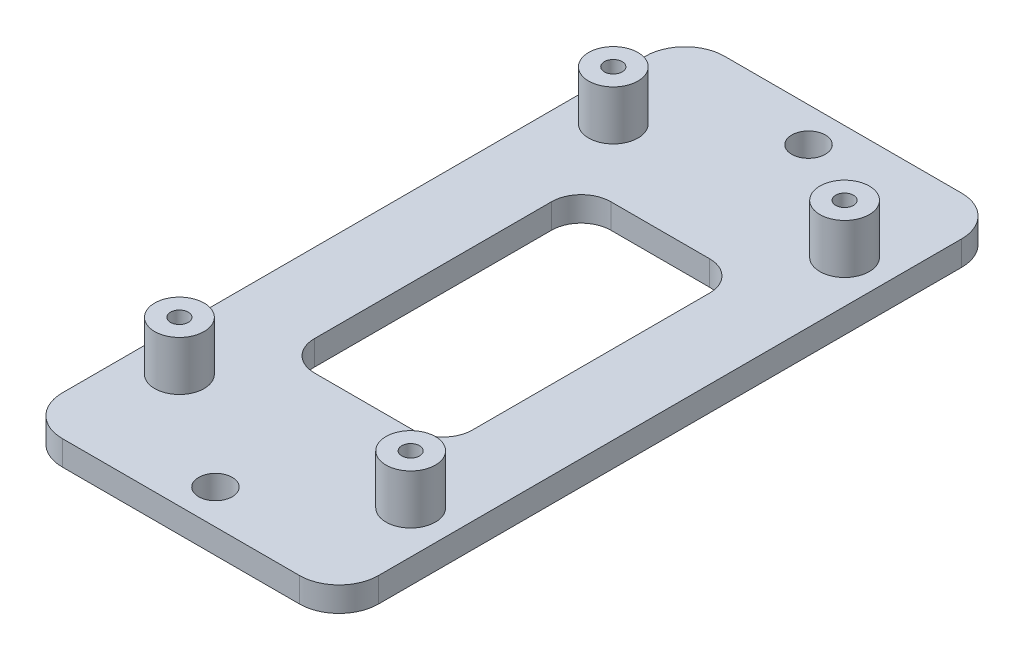
ISO-10303-21;
HEADER;
FILE_DESCRIPTION(('STEP AP214'),'2;1');
FILE_NAME('part.step','',(''),(''),'','','');
FILE_SCHEMA(('AUTOMOTIVE_DESIGN { 1 0 10303 214 1 1 1 1 }'));
ENDSEC;
DATA;
#1=APPLICATION_CONTEXT('core data for automotive mechanical design processes');
#2=APPLICATION_PROTOCOL_DEFINITION('international standard','automotive_design',2000,#1);
#3=PRODUCT_CONTEXT('',#1,'mechanical');
#4=PRODUCT('Part','Part','',(#3));
#5=PRODUCT_RELATED_PRODUCT_CATEGORY('part','',(#4));
#6=PRODUCT_DEFINITION_FORMATION('','',#4);
#7=PRODUCT_DEFINITION_CONTEXT('part definition',#1,'design');
#8=PRODUCT_DEFINITION('design','',#6,#7);
#9=PRODUCT_DEFINITION_SHAPE('','',#8);
#10=(LENGTH_UNIT() NAMED_UNIT(*) SI_UNIT(.MILLI.,.METRE.));
#11=(NAMED_UNIT(*) PLANE_ANGLE_UNIT() SI_UNIT($,.RADIAN.));
#12=(NAMED_UNIT(*) SI_UNIT($,.STERADIAN.) SOLID_ANGLE_UNIT());
#13=UNCERTAINTY_MEASURE_WITH_UNIT(LENGTH_MEASURE(1.E-05),#10,'distance_accuracy_value','');
#14=(GEOMETRIC_REPRESENTATION_CONTEXT(3) GLOBAL_UNCERTAINTY_ASSIGNED_CONTEXT((#13)) GLOBAL_UNIT_ASSIGNED_CONTEXT((#10,
#11,#12)) REPRESENTATION_CONTEXT('',''));
#15=CARTESIAN_POINT('',(0.,0.,0.));
#16=DIRECTION('',(0.,0.,1.));
#17=DIRECTION('',(1.,0.,0.));
#18=AXIS2_PLACEMENT_3D('',#15,#16,#17);
#19=CARTESIAN_POINT('',(274.95,496.02,534.67));
#20=DIRECTION('',(0.,-1.,0.));
#21=DIRECTION('',(0.,0.,-1.));
#22=AXIS2_PLACEMENT_3D('',#19,#20,#21);
#23=PLANE('',#22);
#24=CARTESIAN_POINT('',(274.95,496.02,534.67));
#25=DIRECTION('',(0.,-1.,0.));
#26=DIRECTION('',(1.,0.,0.));
#27=AXIS2_PLACEMENT_3D('',#24,#25,#26);
#28=CIRCLE('',#27,0.9);
#29=CARTESIAN_POINT('',(275.85,496.02,534.67));
#30=VERTEX_POINT('',#29);
#31=EDGE_CURVE('E9',#30,#30,#28,.T.);
#32=ORIENTED_EDGE('',*,*,#31,.F.);
#33=EDGE_LOOP('',(#32));
#34=FACE_BOUND('',#33,.T.);
#35=ADVANCED_FACE('F15',(#34),#23,.F.);
#36=CARTESIAN_POINT('',(274.95,496.02,490.77));
#37=DIRECTION('',(0.,-1.,0.));
#38=DIRECTION('',(0.,0.,-1.));
#39=AXIS2_PLACEMENT_3D('',#36,#37,#38);
#40=PLANE('',#39);
#41=CARTESIAN_POINT('',(274.95,496.02,490.77));
#42=DIRECTION('',(0.,-1.,0.));
#43=DIRECTION('',(1.,0.,0.));
#44=AXIS2_PLACEMENT_3D('',#41,#42,#43);
#45=CIRCLE('',#44,0.9);
#46=CARTESIAN_POINT('',(275.85,496.02,490.77));
#47=VERTEX_POINT('',#46);
#48=EDGE_CURVE('E169',#47,#47,#45,.T.);
#49=ORIENTED_EDGE('',*,*,#48,.F.);
#50=EDGE_LOOP('',(#49));
#51=FACE_BOUND('',#50,.T.);
#52=ADVANCED_FACE('F468',(#51),#40,.F.);
#53=CARTESIAN_POINT('',(251.55,496.02,534.67));
#54=DIRECTION('',(0.,-1.,0.));
#55=DIRECTION('',(0.,0.,-1.));
#56=AXIS2_PLACEMENT_3D('',#53,#54,#55);
#57=PLANE('',#56);
#58=CARTESIAN_POINT('',(251.55,496.02,534.67));
#59=DIRECTION('',(0.,-1.,0.));
#60=DIRECTION('',(1.,0.,0.));
#61=AXIS2_PLACEMENT_3D('',#58,#59,#60);
#62=CIRCLE('',#61,0.9);
#63=CARTESIAN_POINT('',(252.45,496.02,534.67));
#64=VERTEX_POINT('',#63);
#65=EDGE_CURVE('E157',#64,#64,#62,.T.);
#66=ORIENTED_EDGE('',*,*,#65,.F.);
#67=EDGE_LOOP('',(#66));
#68=FACE_BOUND('',#67,.T.);
#69=ADVANCED_FACE('F464',(#68),#57,.F.);
#70=CARTESIAN_POINT('',(251.55,496.02,490.77));
#71=DIRECTION('',(0.,-1.,0.));
#72=DIRECTION('',(0.,0.,-1.));
#73=AXIS2_PLACEMENT_3D('',#70,#71,#72);
#74=PLANE('',#73);
#75=CARTESIAN_POINT('',(251.55,496.02,490.77));
#76=DIRECTION('',(0.,-1.,0.));
#77=DIRECTION('',(1.,0.,0.));
#78=AXIS2_PLACEMENT_3D('',#75,#76,#77);
#79=CIRCLE('',#78,0.9);
#80=CARTESIAN_POINT('',(252.45,496.02,490.77));
#81=VERTEX_POINT('',#80);
#82=EDGE_CURVE('E171',#81,#81,#79,.T.);
#83=ORIENTED_EDGE('',*,*,#82,.F.);
#84=EDGE_LOOP('',(#83));
#85=FACE_BOUND('',#84,.T.);
#86=ADVANCED_FACE('F456',(#85),#74,.F.);
#87=CARTESIAN_POINT('',(274.95,496.02,534.67));
#88=DIRECTION('',(0.,-1.,0.));
#89=DIRECTION('',(1.,0.,0.));
#90=AXIS2_PLACEMENT_3D('',#87,#88,#89);
#91=CYLINDRICAL_SURFACE('',#90,0.9);
#92=DIRECTION('',(0.,1.,0.));
#93=VECTOR('',#92,1.);
#94=CARTESIAN_POINT('',(275.85,496.02,534.67));
#95=LINE('',#94,#93);
#96=CARTESIAN_POINT('',(275.85,502.52,534.67));
#97=VERTEX_POINT('',#96);
#98=EDGE_CURVE('E24',#30,#97,#95,.T.);
#99=ORIENTED_EDGE('',*,*,#98,.T.);
#100=CARTESIAN_POINT('',(274.95,502.52,534.67));
#101=DIRECTION('',(0.,-1.,0.));
#102=DIRECTION('',(1.,0.,0.));
#103=AXIS2_PLACEMENT_3D('',#100,#101,#102);
#104=CIRCLE('',#103,0.9);
#105=EDGE_CURVE('E228',#97,#97,#104,.T.);
#106=ORIENTED_EDGE('',*,*,#105,.F.);
#107=ORIENTED_EDGE('',*,*,#98,.F.);
#108=ORIENTED_EDGE('',*,*,#31,.T.);
#109=EDGE_LOOP('',(#99,#106,#107,#108));
#110=FACE_BOUND('',#109,.T.);
#111=ADVANCED_FACE('F453',(#110),#91,.F.);
#112=CARTESIAN_POINT('',(274.95,496.02,490.77));
#113=DIRECTION('',(0.,-1.,0.));
#114=DIRECTION('',(1.,0.,0.));
#115=AXIS2_PLACEMENT_3D('',#112,#113,#114);
#116=CYLINDRICAL_SURFACE('',#115,0.9);
#117=DIRECTION('',(0.,1.,0.));
#118=VECTOR('',#117,1.);
#119=CARTESIAN_POINT('',(275.85,496.02,490.77));
#120=LINE('',#119,#118);
#121=CARTESIAN_POINT('',(275.85,502.52,490.77));
#122=VERTEX_POINT('',#121);
#123=EDGE_CURVE('E164',#47,#122,#120,.T.);
#124=ORIENTED_EDGE('',*,*,#123,.T.);
#125=CARTESIAN_POINT('',(274.95,502.52,490.77));
#126=DIRECTION('',(0.,-1.,0.));
#127=DIRECTION('',(1.,0.,0.));
#128=AXIS2_PLACEMENT_3D('',#125,#126,#127);
#129=CIRCLE('',#128,0.9);
#130=EDGE_CURVE('E445',#122,#122,#129,.T.);
#131=ORIENTED_EDGE('',*,*,#130,.F.);
#132=ORIENTED_EDGE('',*,*,#123,.F.);
#133=ORIENTED_EDGE('',*,*,#48,.T.);
#134=EDGE_LOOP('',(#124,#131,#132,#133));
#135=FACE_BOUND('',#134,.T.);
#136=ADVANCED_FACE('F455',(#135),#116,.F.);
#137=CARTESIAN_POINT('',(251.55,496.02,534.67));
#138=DIRECTION('',(0.,-1.,0.));
#139=DIRECTION('',(1.,0.,0.));
#140=AXIS2_PLACEMENT_3D('',#137,#138,#139);
#141=CYLINDRICAL_SURFACE('',#140,0.9);
#142=DIRECTION('',(0.,1.,0.));
#143=VECTOR('',#142,1.);
#144=CARTESIAN_POINT('',(252.45,496.02,534.67));
#145=LINE('',#144,#143);
#146=CARTESIAN_POINT('',(252.45,502.52,534.67));
#147=VERTEX_POINT('',#146);
#148=EDGE_CURVE('E160',#64,#147,#145,.T.);
#149=ORIENTED_EDGE('',*,*,#148,.T.);
#150=CARTESIAN_POINT('',(251.55,502.52,534.67));
#151=DIRECTION('',(0.,-1.,0.));
#152=DIRECTION('',(1.,0.,0.));
#153=AXIS2_PLACEMENT_3D('',#150,#151,#152);
#154=CIRCLE('',#153,0.9);
#155=EDGE_CURVE('E436',#147,#147,#154,.T.);
#156=ORIENTED_EDGE('',*,*,#155,.F.);
#157=ORIENTED_EDGE('',*,*,#148,.F.);
#158=ORIENTED_EDGE('',*,*,#65,.T.);
#159=EDGE_LOOP('',(#149,#156,#157,#158));
#160=FACE_BOUND('',#159,.T.);
#161=ADVANCED_FACE('F158',(#160),#141,.F.);
#162=CARTESIAN_POINT('',(251.55,496.02,490.77));
#163=DIRECTION('',(0.,-1.,0.));
#164=DIRECTION('',(1.,0.,0.));
#165=AXIS2_PLACEMENT_3D('',#162,#163,#164);
#166=CYLINDRICAL_SURFACE('',#165,0.9);
#167=DIRECTION('',(0.,1.,0.));
#168=VECTOR('',#167,1.);
#169=CARTESIAN_POINT('',(252.45,496.02,490.77));
#170=LINE('',#169,#168);
#171=CARTESIAN_POINT('',(252.45,502.52,490.77));
#172=VERTEX_POINT('',#171);
#173=EDGE_CURVE('E225',#81,#172,#170,.T.);
#174=ORIENTED_EDGE('',*,*,#173,.T.);
#175=CARTESIAN_POINT('',(251.55,502.52,490.77));
#176=DIRECTION('',(0.,-1.,0.));
#177=DIRECTION('',(1.,0.,0.));
#178=AXIS2_PLACEMENT_3D('',#175,#176,#177);
#179=CIRCLE('',#178,0.9);
#180=EDGE_CURVE('E275',#172,#172,#179,.T.);
#181=ORIENTED_EDGE('',*,*,#180,.F.);
#182=ORIENTED_EDGE('',*,*,#173,.F.);
#183=ORIENTED_EDGE('',*,*,#82,.T.);
#184=EDGE_LOOP('',(#174,#181,#182,#183));
#185=FACE_BOUND('',#184,.T.);
#186=ADVANCED_FACE('F669',(#185),#166,.F.);
#187=CARTESIAN_POINT('',(274.95,502.52,534.67));
#188=DIRECTION('',(0.,-1.,0.));
#189=DIRECTION('',(0.,0.,-1.));
#190=AXIS2_PLACEMENT_3D('',#187,#188,#189);
#191=PLANE('',#190);
#192=ORIENTED_EDGE('',*,*,#105,.T.);
#193=EDGE_LOOP('',(#192));
#194=FACE_BOUND('',#193,.T.);
#195=CARTESIAN_POINT('',(274.95,502.52,534.67));
#196=DIRECTION('',(0.,-1.,0.));
#197=DIRECTION('',(1.,0.,0.));
#198=AXIS2_PLACEMENT_3D('',#195,#196,#197);
#199=CIRCLE('',#198,2.5);
#200=CARTESIAN_POINT('',(277.45,502.52,534.67));
#201=VERTEX_POINT('',#200);
#202=EDGE_CURVE('E271',#201,#201,#199,.T.);
#203=ORIENTED_EDGE('',*,*,#202,.F.);
#204=EDGE_LOOP('',(#203));
#205=FACE_BOUND('',#204,.T.);
#206=ADVANCED_FACE('F451',(#194,#205),#191,.F.);
#207=CARTESIAN_POINT('',(274.95,502.52,490.77));
#208=DIRECTION('',(0.,-1.,0.));
#209=DIRECTION('',(0.,0.,-1.));
#210=AXIS2_PLACEMENT_3D('',#207,#208,#209);
#211=PLANE('',#210);
#212=ORIENTED_EDGE('',*,*,#130,.T.);
#213=EDGE_LOOP('',(#212));
#214=FACE_BOUND('',#213,.T.);
#215=CARTESIAN_POINT('',(274.95,502.52,490.77));
#216=DIRECTION('',(0.,-1.,0.));
#217=DIRECTION('',(1.,0.,0.));
#218=AXIS2_PLACEMENT_3D('',#215,#216,#217);
#219=CIRCLE('',#218,2.5);
#220=CARTESIAN_POINT('',(277.45,502.52,490.77));
#221=VERTEX_POINT('',#220);
#222=EDGE_CURVE('E423',#221,#221,#219,.T.);
#223=ORIENTED_EDGE('',*,*,#222,.F.);
#224=EDGE_LOOP('',(#223));
#225=FACE_BOUND('',#224,.T.);
#226=ADVANCED_FACE('F480',(#214,#225),#211,.F.);
#227=CARTESIAN_POINT('',(251.55,502.52,534.67));
#228=DIRECTION('',(0.,-1.,0.));
#229=DIRECTION('',(0.,0.,-1.));
#230=AXIS2_PLACEMENT_3D('',#227,#228,#229);
#231=PLANE('',#230);
#232=ORIENTED_EDGE('',*,*,#155,.T.);
#233=EDGE_LOOP('',(#232));
#234=FACE_BOUND('',#233,.T.);
#235=CARTESIAN_POINT('',(251.55,502.52,534.67));
#236=DIRECTION('',(0.,-1.,0.));
#237=DIRECTION('',(1.,0.,0.));
#238=AXIS2_PLACEMENT_3D('',#235,#236,#237);
#239=CIRCLE('',#238,2.5);
#240=CARTESIAN_POINT('',(254.05,502.52,534.67));
#241=VERTEX_POINT('',#240);
#242=EDGE_CURVE('E430',#241,#241,#239,.T.);
#243=ORIENTED_EDGE('',*,*,#242,.F.);
#244=EDGE_LOOP('',(#243));
#245=FACE_BOUND('',#244,.T.);
#246=ADVANCED_FACE('F483',(#234,#245),#231,.F.);
#247=CARTESIAN_POINT('',(251.55,502.52,490.77));
#248=DIRECTION('',(0.,-1.,0.));
#249=DIRECTION('',(0.,0.,-1.));
#250=AXIS2_PLACEMENT_3D('',#247,#248,#249);
#251=PLANE('',#250);
#252=ORIENTED_EDGE('',*,*,#180,.T.);
#253=EDGE_LOOP('',(#252));
#254=FACE_BOUND('',#253,.T.);
#255=CARTESIAN_POINT('',(251.55,502.52,490.77));
#256=DIRECTION('',(0.,-1.,0.));
#257=DIRECTION('',(1.,0.,0.));
#258=AXIS2_PLACEMENT_3D('',#255,#256,#257);
#259=CIRCLE('',#258,2.5);
#260=CARTESIAN_POINT('',(254.05,502.52,490.77));
#261=VERTEX_POINT('',#260);
#262=EDGE_CURVE('E211',#261,#261,#259,.T.);
#263=ORIENTED_EDGE('',*,*,#262,.F.);
#264=EDGE_LOOP('',(#263));
#265=FACE_BOUND('',#264,.T.);
#266=ADVANCED_FACE('F651',(#254,#265),#251,.F.);
#267=CARTESIAN_POINT('',(274.95,497.42,534.67));
#268=DIRECTION('',(0.,-1.,0.));
#269=DIRECTION('',(1.,0.,0.));
#270=AXIS2_PLACEMENT_3D('',#267,#268,#269);
#271=CYLINDRICAL_SURFACE('',#270,2.5);
#272=CARTESIAN_POINT('',(274.95,497.52,534.67));
#273=DIRECTION('',(0.,-1.,0.));
#274=DIRECTION('',(1.,0.,0.));
#275=AXIS2_PLACEMENT_3D('',#272,#273,#274);
#276=CIRCLE('',#275,2.5);
#277=CARTESIAN_POINT('',(277.45,497.52,534.67));
#278=VERTEX_POINT('',#277);
#279=EDGE_CURVE('E386',#278,#278,#276,.T.);
#280=ORIENTED_EDGE('',*,*,#279,.F.);
#281=DIRECTION('',(0.,1.,0.));
#282=VECTOR('',#281,1.);
#283=CARTESIAN_POINT('',(277.45,497.42,534.67));
#284=LINE('',#283,#282);
#285=EDGE_CURVE('E276',#278,#201,#284,.T.);
#286=ORIENTED_EDGE('',*,*,#285,.T.);
#287=ORIENTED_EDGE('',*,*,#202,.T.);
#288=ORIENTED_EDGE('',*,*,#285,.F.);
#289=EDGE_LOOP('',(#280,#286,#287,#288));
#290=FACE_BOUND('',#289,.T.);
#291=ADVANCED_FACE('F654',(#290),#271,.T.);
#292=CARTESIAN_POINT('',(274.95,497.42,490.77));
#293=DIRECTION('',(0.,-1.,0.));
#294=DIRECTION('',(1.,0.,0.));
#295=AXIS2_PLACEMENT_3D('',#292,#293,#294);
#296=CYLINDRICAL_SURFACE('',#295,2.5);
#297=CARTESIAN_POINT('',(274.95,497.52,490.77));
#298=DIRECTION('',(0.,-1.,0.));
#299=DIRECTION('',(1.,0.,0.));
#300=AXIS2_PLACEMENT_3D('',#297,#298,#299);
#301=CIRCLE('',#300,2.5);
#302=CARTESIAN_POINT('',(277.45,497.52,490.77));
#303=VERTEX_POINT('',#302);
#304=EDGE_CURVE('E262',#303,#303,#301,.T.);
#305=ORIENTED_EDGE('',*,*,#304,.F.);
#306=DIRECTION('',(0.,1.,0.));
#307=VECTOR('',#306,1.);
#308=CARTESIAN_POINT('',(277.45,497.42,490.77));
#309=LINE('',#308,#307);
#310=EDGE_CURVE('E426',#303,#221,#309,.T.);
#311=ORIENTED_EDGE('',*,*,#310,.T.);
#312=ORIENTED_EDGE('',*,*,#222,.T.);
#313=ORIENTED_EDGE('',*,*,#310,.F.);
#314=EDGE_LOOP('',(#305,#311,#312,#313));
#315=FACE_BOUND('',#314,.T.);
#316=ADVANCED_FACE('F488',(#315),#296,.T.);
#317=CARTESIAN_POINT('',(251.55,497.42,534.67));
#318=DIRECTION('',(0.,-1.,0.));
#319=DIRECTION('',(1.,0.,0.));
#320=AXIS2_PLACEMENT_3D('',#317,#318,#319);
#321=CYLINDRICAL_SURFACE('',#320,2.5);
#322=CARTESIAN_POINT('',(251.55,497.52,534.67));
#323=DIRECTION('',(0.,-1.,0.));
#324=DIRECTION('',(1.,0.,0.));
#325=AXIS2_PLACEMENT_3D('',#322,#323,#324);
#326=CIRCLE('',#325,2.5);
#327=CARTESIAN_POINT('',(254.05,497.52,534.67));
#328=VERTEX_POINT('',#327);
#329=EDGE_CURVE('E339',#328,#328,#326,.T.);
#330=ORIENTED_EDGE('',*,*,#329,.F.);
#331=DIRECTION('',(0.,1.,0.));
#332=VECTOR('',#331,1.);
#333=CARTESIAN_POINT('',(254.05,497.42,534.67));
#334=LINE('',#333,#332);
#335=EDGE_CURVE('E214',#328,#241,#334,.T.);
#336=ORIENTED_EDGE('',*,*,#335,.T.);
#337=ORIENTED_EDGE('',*,*,#242,.T.);
#338=ORIENTED_EDGE('',*,*,#335,.F.);
#339=EDGE_LOOP('',(#330,#336,#337,#338));
#340=FACE_BOUND('',#339,.T.);
#341=ADVANCED_FACE('F663',(#340),#321,.T.);
#342=CARTESIAN_POINT('',(251.55,497.42,490.77));
#343=DIRECTION('',(0.,-1.,0.));
#344=DIRECTION('',(1.,0.,0.));
#345=AXIS2_PLACEMENT_3D('',#342,#343,#344);
#346=CYLINDRICAL_SURFACE('',#345,2.5);
#347=CARTESIAN_POINT('',(251.55,497.52,490.77));
#348=DIRECTION('',(0.,-1.,0.));
#349=DIRECTION('',(1.,0.,0.));
#350=AXIS2_PLACEMENT_3D('',#347,#348,#349);
#351=CIRCLE('',#350,2.5);
#352=CARTESIAN_POINT('',(254.05,497.52,490.77));
#353=VERTEX_POINT('',#352);
#354=EDGE_CURVE('E335',#353,#353,#351,.T.);
#355=ORIENTED_EDGE('',*,*,#354,.F.);
#356=DIRECTION('',(0.,1.,0.));
#357=VECTOR('',#356,1.);
#358=CARTESIAN_POINT('',(254.05,497.42,490.77));
#359=LINE('',#358,#357);
#360=EDGE_CURVE('E215',#353,#261,#359,.T.);
#361=ORIENTED_EDGE('',*,*,#360,.T.);
#362=ORIENTED_EDGE('',*,*,#262,.T.);
#363=ORIENTED_EDGE('',*,*,#360,.F.);
#364=EDGE_LOOP('',(#355,#361,#362,#363));
#365=FACE_BOUND('',#364,.T.);
#366=ADVANCED_FACE('F661',(#365),#346,.T.);
#367=CARTESIAN_POINT('',(263.25,494.02,542.72));
#368=DIRECTION('',(0.,-1.,0.));
#369=DIRECTION('',(1.,0.,0.));
#370=AXIS2_PLACEMENT_3D('',#367,#368,#369);
#371=CYLINDRICAL_SURFACE('',#370,1.7);
#372=DIRECTION('',(0.,1.,0.));
#373=VECTOR('',#372,1.);
#374=CARTESIAN_POINT('',(264.95,494.02,542.72));
#375=LINE('',#374,#373);
#376=CARTESIAN_POINT('',(264.95,495.02,542.72));
#377=VERTEX_POINT('',#376);
#378=CARTESIAN_POINT('',(264.95,497.52,542.72));
#379=VERTEX_POINT('',#378);
#380=EDGE_CURVE('E378',#377,#379,#375,.T.);
#381=ORIENTED_EDGE('',*,*,#380,.T.);
#382=CARTESIAN_POINT('',(263.25,497.52,542.72));
#383=DIRECTION('',(0.,-1.,0.));
#384=DIRECTION('',(1.,0.,0.));
#385=AXIS2_PLACEMENT_3D('',#382,#383,#384);
#386=CIRCLE('',#385,1.7);
#387=EDGE_CURVE('E266',#379,#379,#386,.T.);
#388=ORIENTED_EDGE('',*,*,#387,.F.);
#389=ORIENTED_EDGE('',*,*,#380,.F.);
#390=CARTESIAN_POINT('',(263.25,495.02,542.72));
#391=DIRECTION('',(0.,-1.,0.));
#392=DIRECTION('',(1.,0.,0.));
#393=AXIS2_PLACEMENT_3D('',#390,#391,#392);
#394=CIRCLE('',#393,1.7);
#395=EDGE_CURVE('E303',#377,#377,#394,.T.);
#396=ORIENTED_EDGE('',*,*,#395,.T.);
#397=EDGE_LOOP('',(#381,#388,#389,#396));
#398=FACE_BOUND('',#397,.T.);
#399=ADVANCED_FACE('F658',(#398),#371,.F.);
#400=CARTESIAN_POINT('',(268.25,494.02,500.72));
#401=DIRECTION('',(0.,1.,0.));
#402=DIRECTION('',(1.,0.,0.));
#403=AXIS2_PLACEMENT_3D('',#400,#401,#402);
#404=CYLINDRICAL_SURFACE('',#403,3.);
#405=CARTESIAN_POINT('',(268.25,497.52,500.72));
#406=DIRECTION('',(0.,1.,0.));
#407=DIRECTION('',(1.,0.,0.));
#408=AXIS2_PLACEMENT_3D('',#405,#406,#407);
#409=CIRCLE('',#408,3.);
#410=CARTESIAN_POINT('',(271.25,497.52,500.72));
#411=VERTEX_POINT('',#410);
#412=CARTESIAN_POINT('',(268.25,497.52,497.72));
#413=VERTEX_POINT('',#412);
#414=EDGE_CURVE('E363',#411,#413,#409,.T.);
#415=ORIENTED_EDGE('',*,*,#414,.T.);
#416=DIRECTION('',(0.,1.,0.));
#417=VECTOR('',#416,1.);
#418=CARTESIAN_POINT('',(268.25,494.02,497.72));
#419=LINE('',#418,#417);
#420=CARTESIAN_POINT('',(268.25,495.02,497.72));
#421=VERTEX_POINT('',#420);
#422=EDGE_CURVE('E415',#421,#413,#419,.T.);
#423=ORIENTED_EDGE('',*,*,#422,.F.);
#424=CARTESIAN_POINT('',(268.25,495.02,500.72));
#425=DIRECTION('',(0.,1.,0.));
#426=DIRECTION('',(1.,0.,0.));
#427=AXIS2_PLACEMENT_3D('',#424,#425,#426);
#428=CIRCLE('',#427,3.);
#429=CARTESIAN_POINT('',(271.25,495.02,500.72));
#430=VERTEX_POINT('',#429);
#431=EDGE_CURVE('E236',#430,#421,#428,.T.);
#432=ORIENTED_EDGE('',*,*,#431,.F.);
#433=DIRECTION('',(0.,1.,0.));
#434=VECTOR('',#433,1.);
#435=CARTESIAN_POINT('',(271.25,494.02,500.72));
#436=LINE('',#435,#434);
#437=EDGE_CURVE('E382',#430,#411,#436,.T.);
#438=ORIENTED_EDGE('',*,*,#437,.T.);
#439=EDGE_LOOP('',(#415,#423,#432,#438));
#440=FACE_BOUND('',#439,.T.);
#441=ADVANCED_FACE('F623',(#440),#404,.F.);
#442=CARTESIAN_POINT('',(271.25,494.02,497.72));
#443=DIRECTION('',(1.,0.,0.));
#444=DIRECTION('',(0.,1.,0.));
#445=AXIS2_PLACEMENT_3D('',#442,#443,#444);
#446=PLANE('',#445);
#447=DIRECTION('',(0.,1.,0.));
#448=VECTOR('',#447,1.);
#449=CARTESIAN_POINT('',(271.25,494.02,524.72));
#450=LINE('',#449,#448);
#451=CARTESIAN_POINT('',(271.25,495.02,524.72));
#452=VERTEX_POINT('',#451);
#453=CARTESIAN_POINT('',(271.25,497.52,524.72));
#454=VERTEX_POINT('',#453);
#455=EDGE_CURVE('E412',#452,#454,#450,.T.);
#456=ORIENTED_EDGE('',*,*,#455,.T.);
#457=DIRECTION('',(0.,0.,-1.));
#458=VECTOR('',#457,1.);
#459=CARTESIAN_POINT('',(271.25,497.52,488.47));
#460=LINE('',#459,#458);
#461=EDGE_CURVE('E367',#454,#411,#460,.T.);
#462=ORIENTED_EDGE('',*,*,#461,.T.);
#463=ORIENTED_EDGE('',*,*,#437,.F.);
#464=DIRECTION('',(0.,0.,-1.));
#465=VECTOR('',#464,1.);
#466=CARTESIAN_POINT('',(271.25,495.02,488.47));
#467=LINE('',#466,#465);
#468=EDGE_CURVE('E232',#452,#430,#467,.T.);
#469=ORIENTED_EDGE('',*,*,#468,.F.);
#470=EDGE_LOOP('',(#456,#462,#463,#469));
#471=FACE_BOUND('',#470,.T.);
#472=ADVANCED_FACE('F627',(#471),#446,.F.);
#473=CARTESIAN_POINT('',(255.25,494.02,497.72));
#474=DIRECTION('',(0.,0.,1.));
#475=DIRECTION('',(1.,0.,0.));
#476=AXIS2_PLACEMENT_3D('',#473,#474,#475);
#477=PLANE('',#476);
#478=DIRECTION('',(1.,0.,0.));
#479=VECTOR('',#478,1.);
#480=CARTESIAN_POINT('',(251.25,497.52,497.72));
#481=LINE('',#480,#479);
#482=CARTESIAN_POINT('',(258.25,497.52,497.72));
#483=VERTEX_POINT('',#482);
#484=EDGE_CURVE('E359',#483,#413,#481,.T.);
#485=ORIENTED_EDGE('',*,*,#484,.F.);
#486=DIRECTION('',(0.,1.,0.));
#487=VECTOR('',#486,1.);
#488=CARTESIAN_POINT('',(258.25,494.02,497.72));
#489=LINE('',#488,#487);
#490=CARTESIAN_POINT('',(258.25,495.02,497.72));
#491=VERTEX_POINT('',#490);
#492=EDGE_CURVE('E246',#491,#483,#489,.T.);
#493=ORIENTED_EDGE('',*,*,#492,.F.);
#494=DIRECTION('',(1.,0.,0.));
#495=VECTOR('',#494,1.);
#496=CARTESIAN_POINT('',(251.25,495.02,497.72));
#497=LINE('',#496,#495);
#498=EDGE_CURVE('E280',#491,#421,#497,.T.);
#499=ORIENTED_EDGE('',*,*,#498,.T.);
#500=ORIENTED_EDGE('',*,*,#422,.T.);
#501=EDGE_LOOP('',(#485,#493,#499,#500));
#502=FACE_BOUND('',#501,.T.);
#503=ADVANCED_FACE('F618',(#502),#477,.T.);
#504=CARTESIAN_POINT('',(268.25,494.02,524.72));
#505=DIRECTION('',(0.,1.,0.));
#506=DIRECTION('',(1.,0.,0.));
#507=AXIS2_PLACEMENT_3D('',#504,#505,#506);
#508=CYLINDRICAL_SURFACE('',#507,3.);
#509=ORIENTED_EDGE('',*,*,#455,.F.);
#510=CARTESIAN_POINT('',(268.25,495.02,524.72));
#511=DIRECTION('',(0.,1.,0.));
#512=DIRECTION('',(1.,0.,0.));
#513=AXIS2_PLACEMENT_3D('',#510,#511,#512);
#514=CIRCLE('',#513,3.);
#515=CARTESIAN_POINT('',(268.25,495.02,527.72));
#516=VERTEX_POINT('',#515);
#517=EDGE_CURVE('E188',#516,#452,#514,.T.);
#518=ORIENTED_EDGE('',*,*,#517,.F.);
#519=DIRECTION('',(0.,1.,0.));
#520=VECTOR('',#519,1.);
#521=CARTESIAN_POINT('',(268.25,494.02,527.72));
#522=LINE('',#521,#520);
#523=CARTESIAN_POINT('',(268.25,497.52,527.72));
#524=VERTEX_POINT('',#523);
#525=EDGE_CURVE('E243',#516,#524,#522,.T.);
#526=ORIENTED_EDGE('',*,*,#525,.T.);
#527=CARTESIAN_POINT('',(268.25,497.52,524.72));
#528=DIRECTION('',(0.,1.,0.));
#529=DIRECTION('',(1.,0.,0.));
#530=AXIS2_PLACEMENT_3D('',#527,#528,#529);
#531=CIRCLE('',#530,3.);
#532=EDGE_CURVE('E371',#524,#454,#531,.T.);
#533=ORIENTED_EDGE('',*,*,#532,.T.);
#534=EDGE_LOOP('',(#509,#518,#526,#533));
#535=FACE_BOUND('',#534,.T.);
#536=ADVANCED_FACE('F631',(#535),#508,.F.);
#537=CARTESIAN_POINT('',(258.25,494.02,500.72));
#538=DIRECTION('',(0.,1.,0.));
#539=DIRECTION('',(-1.,0.,0.));
#540=AXIS2_PLACEMENT_3D('',#537,#538,#539);
#541=CYLINDRICAL_SURFACE('',#540,3.);
#542=DIRECTION('',(0.,1.,0.));
#543=VECTOR('',#542,1.);
#544=CARTESIAN_POINT('',(255.25,494.02,500.72));
#545=LINE('',#544,#543);
#546=CARTESIAN_POINT('',(255.25,495.02,500.72));
#547=VERTEX_POINT('',#546);
#548=CARTESIAN_POINT('',(255.25,497.52,500.72));
#549=VERTEX_POINT('',#548);
#550=EDGE_CURVE('E247',#547,#549,#545,.T.);
#551=ORIENTED_EDGE('',*,*,#550,.F.);
#552=CARTESIAN_POINT('',(258.25,495.02,500.72));
#553=DIRECTION('',(0.,1.,0.));
#554=DIRECTION('',(-1.,0.,0.));
#555=AXIS2_PLACEMENT_3D('',#552,#553,#554);
#556=CIRCLE('',#555,3.);
#557=EDGE_CURVE('E284',#491,#547,#556,.T.);
#558=ORIENTED_EDGE('',*,*,#557,.F.);
#559=ORIENTED_EDGE('',*,*,#492,.T.);
#560=CARTESIAN_POINT('',(258.25,497.52,500.72));
#561=DIRECTION('',(0.,1.,0.));
#562=DIRECTION('',(-1.,0.,0.));
#563=AXIS2_PLACEMENT_3D('',#560,#561,#562);
#564=CIRCLE('',#563,3.);
#565=EDGE_CURVE('E355',#483,#549,#564,.T.);
#566=ORIENTED_EDGE('',*,*,#565,.T.);
#567=EDGE_LOOP('',(#551,#558,#559,#566));
#568=FACE_BOUND('',#567,.T.);
#569=ADVANCED_FACE('F614',(#568),#541,.F.);
#570=CARTESIAN_POINT('',(255.25,494.02,527.72));
#571=DIRECTION('',(0.,0.,1.));
#572=DIRECTION('',(1.,0.,0.));
#573=AXIS2_PLACEMENT_3D('',#570,#571,#572);
#574=PLANE('',#573);
#575=ORIENTED_EDGE('',*,*,#525,.F.);
#576=DIRECTION('',(1.,0.,0.));
#577=VECTOR('',#576,1.);
#578=CARTESIAN_POINT('',(251.25,495.02,527.72));
#579=LINE('',#578,#577);
#580=CARTESIAN_POINT('',(258.25,495.02,527.72));
#581=VERTEX_POINT('',#580);
#582=EDGE_CURVE('E261',#581,#516,#579,.T.);
#583=ORIENTED_EDGE('',*,*,#582,.F.);
#584=DIRECTION('',(0.,1.,0.));
#585=VECTOR('',#584,1.);
#586=CARTESIAN_POINT('',(258.25,494.02,527.72));
#587=LINE('',#586,#585);
#588=CARTESIAN_POINT('',(258.25,497.52,527.72));
#589=VERTEX_POINT('',#588);
#590=EDGE_CURVE('E405',#581,#589,#587,.T.);
#591=ORIENTED_EDGE('',*,*,#590,.T.);
#592=DIRECTION('',(1.,0.,0.));
#593=VECTOR('',#592,1.);
#594=CARTESIAN_POINT('',(251.25,497.52,527.72));
#595=LINE('',#594,#593);
#596=EDGE_CURVE('E267',#589,#524,#595,.T.);
#597=ORIENTED_EDGE('',*,*,#596,.T.);
#598=EDGE_LOOP('',(#575,#583,#591,#597));
#599=FACE_BOUND('',#598,.T.);
#600=ADVANCED_FACE('F633',(#599),#574,.F.);
#601=CARTESIAN_POINT('',(255.25,494.02,497.72));
#602=DIRECTION('',(1.,0.,0.));
#603=DIRECTION('',(0.,1.,0.));
#604=AXIS2_PLACEMENT_3D('',#601,#602,#603);
#605=PLANE('',#604);
#606=DIRECTION('',(0.,0.,-1.));
#607=VECTOR('',#606,1.);
#608=CARTESIAN_POINT('',(255.25,495.02,488.47));
#609=LINE('',#608,#607);
#610=CARTESIAN_POINT('',(255.25,495.02,524.72));
#611=VERTEX_POINT('',#610);
#612=EDGE_CURVE('E295',#611,#547,#609,.T.);
#613=ORIENTED_EDGE('',*,*,#612,.T.);
#614=ORIENTED_EDGE('',*,*,#550,.T.);
#615=DIRECTION('',(0.,0.,-1.));
#616=VECTOR('',#615,1.);
#617=CARTESIAN_POINT('',(255.25,497.52,488.47));
#618=LINE('',#617,#616);
#619=CARTESIAN_POINT('',(255.25,497.52,524.72));
#620=VERTEX_POINT('',#619);
#621=EDGE_CURVE('E351',#620,#549,#618,.T.);
#622=ORIENTED_EDGE('',*,*,#621,.F.);
#623=DIRECTION('',(0.,1.,0.));
#624=VECTOR('',#623,1.);
#625=CARTESIAN_POINT('',(255.25,494.02,524.72));
#626=LINE('',#625,#624);
#627=EDGE_CURVE('E321',#611,#620,#626,.T.);
#628=ORIENTED_EDGE('',*,*,#627,.F.);
#629=EDGE_LOOP('',(#613,#614,#622,#628));
#630=FACE_BOUND('',#629,.T.);
#631=ADVANCED_FACE('F605',(#630),#605,.T.);
#632=CARTESIAN_POINT('',(258.25,494.02,524.72));
#633=DIRECTION('',(0.,1.,0.));
#634=DIRECTION('',(-1.,0.,0.));
#635=AXIS2_PLACEMENT_3D('',#632,#633,#634);
#636=CYLINDRICAL_SURFACE('',#635,3.);
#637=CARTESIAN_POINT('',(258.25,497.52,524.72));
#638=DIRECTION('',(0.,1.,0.));
#639=DIRECTION('',(-1.,0.,0.));
#640=AXIS2_PLACEMENT_3D('',#637,#638,#639);
#641=CIRCLE('',#640,3.);
#642=EDGE_CURVE('E347',#620,#589,#641,.T.);
#643=ORIENTED_EDGE('',*,*,#642,.T.);
#644=ORIENTED_EDGE('',*,*,#590,.F.);
#645=CARTESIAN_POINT('',(258.25,495.02,524.72));
#646=DIRECTION('',(0.,1.,0.));
#647=DIRECTION('',(-1.,0.,0.));
#648=AXIS2_PLACEMENT_3D('',#645,#646,#647);
#649=CIRCLE('',#648,3.);
#650=EDGE_CURVE('E299',#611,#581,#649,.T.);
#651=ORIENTED_EDGE('',*,*,#650,.F.);
#652=ORIENTED_EDGE('',*,*,#627,.T.);
#653=EDGE_LOOP('',(#643,#644,#651,#652));
#654=FACE_BOUND('',#653,.T.);
#655=ADVANCED_FACE('F608',(#654),#636,.F.);
#656=CARTESIAN_POINT('',(263.25,494.02,482.72));
#657=DIRECTION('',(0.,-1.,0.));
#658=DIRECTION('',(1.,0.,0.));
#659=AXIS2_PLACEMENT_3D('',#656,#657,#658);
#660=CYLINDRICAL_SURFACE('',#659,1.7);
#661=DIRECTION('',(0.,1.,0.));
#662=VECTOR('',#661,1.);
#663=CARTESIAN_POINT('',(264.95,494.02,482.72));
#664=LINE('',#663,#662);
#665=CARTESIAN_POINT('',(264.95,495.02,482.72));
#666=VERTEX_POINT('',#665);
#667=CARTESIAN_POINT('',(264.95,497.52,482.72));
#668=VERTEX_POINT('',#667);
#669=EDGE_CURVE('E402',#666,#668,#664,.T.);
#670=ORIENTED_EDGE('',*,*,#669,.T.);
#671=CARTESIAN_POINT('',(263.25,497.52,482.72));
#672=DIRECTION('',(0.,-1.,0.));
#673=DIRECTION('',(1.,0.,0.));
#674=AXIS2_PLACEMENT_3D('',#671,#672,#673);
#675=CIRCLE('',#674,1.7);
#676=EDGE_CURVE('E343',#668,#668,#675,.T.);
#677=ORIENTED_EDGE('',*,*,#676,.F.);
#678=ORIENTED_EDGE('',*,*,#669,.F.);
#679=CARTESIAN_POINT('',(263.25,495.02,482.72));
#680=DIRECTION('',(0.,-1.,0.));
#681=DIRECTION('',(1.,0.,0.));
#682=AXIS2_PLACEMENT_3D('',#679,#680,#681);
#683=CIRCLE('',#682,1.7);
#684=EDGE_CURVE('E251',#666,#666,#683,.T.);
#685=ORIENTED_EDGE('',*,*,#684,.T.);
#686=EDGE_LOOP('',(#670,#677,#678,#685));
#687=FACE_BOUND('',#686,.T.);
#688=ADVANCED_FACE('F705',(#687),#660,.F.);
#689=CARTESIAN_POINT('',(247.25,495.02,546.22));
#690=DIRECTION('',(0.,0.,1.));
#691=DIRECTION('',(1.,0.,0.));
#692=AXIS2_PLACEMENT_3D('',#689,#690,#691);
#693=PLANE('',#692);
#694=DIRECTION('',(1.,0.,0.));
#695=VECTOR('',#694,1.);
#696=CARTESIAN_POINT('',(247.25,497.52,546.22));
#697=LINE('',#696,#695);
#698=CARTESIAN_POINT('',(251.25,497.52,546.22));
#699=VERTEX_POINT('',#698);
#700=CARTESIAN_POINT('',(275.25,497.52,546.22));
#701=VERTEX_POINT('',#700);
#702=EDGE_CURVE('E257',#699,#701,#697,.T.);
#703=ORIENTED_EDGE('',*,*,#702,.F.);
#704=DIRECTION('',(0.,1.,0.));
#705=VECTOR('',#704,1.);
#706=CARTESIAN_POINT('',(251.25,495.02,546.22));
#707=LINE('',#706,#705);
#708=CARTESIAN_POINT('',(251.25,495.02,546.22));
#709=VERTEX_POINT('',#708);
#710=EDGE_CURVE('E315',#709,#699,#707,.T.);
#711=ORIENTED_EDGE('',*,*,#710,.F.);
#712=DIRECTION('',(1.,0.,0.));
#713=VECTOR('',#712,1.);
#714=CARTESIAN_POINT('',(247.25,495.02,546.22));
#715=LINE('',#714,#713);
#716=CARTESIAN_POINT('',(275.25,495.02,546.22));
#717=VERTEX_POINT('',#716);
#718=EDGE_CURVE('E197',#709,#717,#715,.T.);
#719=ORIENTED_EDGE('',*,*,#718,.T.);
#720=DIRECTION('',(0.,1.,0.));
#721=VECTOR('',#720,1.);
#722=CARTESIAN_POINT('',(275.25,495.02,546.22));
#723=LINE('',#722,#721);
#724=EDGE_CURVE('E399',#717,#701,#723,.T.);
#725=ORIENTED_EDGE('',*,*,#724,.T.);
#726=EDGE_LOOP('',(#703,#711,#719,#725));
#727=FACE_BOUND('',#726,.T.);
#728=ADVANCED_FACE('F703',(#727),#693,.T.);
#729=CARTESIAN_POINT('',(275.25,495.02,542.22));
#730=DIRECTION('',(0.,1.,0.));
#731=DIRECTION('',(1.,0.,0.));
#732=AXIS2_PLACEMENT_3D('',#729,#730,#731);
#733=CYLINDRICAL_SURFACE('',#732,4.);
#734=DIRECTION('',(0.,1.,0.));
#735=VECTOR('',#734,1.);
#736=CARTESIAN_POINT('',(279.25,495.02,542.22));
#737=LINE('',#736,#735);
#738=CARTESIAN_POINT('',(279.25,495.02,542.22));
#739=VERTEX_POINT('',#738);
#740=CARTESIAN_POINT('',(279.25,497.52,542.22));
#741=VERTEX_POINT('',#740);
#742=EDGE_CURVE('E396',#739,#741,#737,.T.);
#743=ORIENTED_EDGE('',*,*,#742,.T.);
#744=CARTESIAN_POINT('',(275.25,497.52,542.22));
#745=DIRECTION('',(0.,-1.,0.));
#746=DIRECTION('',(0.,0.,1.));
#747=AXIS2_PLACEMENT_3D('',#744,#745,#746);
#748=CIRCLE('',#747,4.);
#749=EDGE_CURVE('E252',#741,#701,#748,.T.);
#750=ORIENTED_EDGE('',*,*,#749,.T.);
#751=ORIENTED_EDGE('',*,*,#724,.F.);
#752=CARTESIAN_POINT('',(275.25,495.02,542.22));
#753=DIRECTION('',(0.,-1.,0.));
#754=DIRECTION('',(0.,0.,1.));
#755=AXIS2_PLACEMENT_3D('',#752,#753,#754);
#756=CIRCLE('',#755,4.);
#757=EDGE_CURVE('E202',#739,#717,#756,.T.);
#758=ORIENTED_EDGE('',*,*,#757,.F.);
#759=EDGE_LOOP('',(#743,#750,#751,#758));
#760=FACE_BOUND('',#759,.T.);
#761=ADVANCED_FACE('F701',(#760),#733,.T.);
#762=CARTESIAN_POINT('',(279.25,495.02,479.22));
#763=DIRECTION('',(1.,0.,0.));
#764=DIRECTION('',(0.,1.,0.));
#765=AXIS2_PLACEMENT_3D('',#762,#763,#764);
#766=PLANE('',#765);
#767=DIRECTION('',(0.,0.,1.));
#768=VECTOR('',#767,1.);
#769=CARTESIAN_POINT('',(279.25,495.02,479.22));
#770=LINE('',#769,#768);
#771=CARTESIAN_POINT('',(279.25,495.02,483.22));
#772=VERTEX_POINT('',#771);
#773=EDGE_CURVE('E224',#772,#739,#770,.T.);
#774=ORIENTED_EDGE('',*,*,#773,.F.);
#775=DIRECTION('',(0.,1.,0.));
#776=VECTOR('',#775,1.);
#777=CARTESIAN_POINT('',(279.25,495.02,483.22));
#778=LINE('',#777,#776);
#779=CARTESIAN_POINT('',(279.25,497.52,483.22));
#780=VERTEX_POINT('',#779);
#781=EDGE_CURVE('E393',#772,#780,#778,.T.);
#782=ORIENTED_EDGE('',*,*,#781,.T.);
#783=DIRECTION('',(0.,0.,1.));
#784=VECTOR('',#783,1.);
#785=CARTESIAN_POINT('',(279.25,497.52,479.22));
#786=LINE('',#785,#784);
#787=EDGE_CURVE('E256',#780,#741,#786,.T.);
#788=ORIENTED_EDGE('',*,*,#787,.T.);
#789=ORIENTED_EDGE('',*,*,#742,.F.);
#790=EDGE_LOOP('',(#774,#782,#788,#789));
#791=FACE_BOUND('',#790,.T.);
#792=ADVANCED_FACE('F698',(#791),#766,.T.);
#793=CARTESIAN_POINT('',(275.25,495.02,483.22));
#794=DIRECTION('',(0.,1.,0.));
#795=DIRECTION('',(1.,0.,0.));
#796=AXIS2_PLACEMENT_3D('',#793,#794,#795);
#797=CYLINDRICAL_SURFACE('',#796,4.);
#798=CARTESIAN_POINT('',(275.25,495.02,483.22));
#799=DIRECTION('',(0.,1.,0.));
#800=DIRECTION('',(0.,0.,1.));
#801=AXIS2_PLACEMENT_3D('',#798,#799,#800);
#802=CIRCLE('',#801,4.);
#803=CARTESIAN_POINT('',(275.25,495.02,479.22));
#804=VERTEX_POINT('',#803);
#805=EDGE_CURVE('E210',#772,#804,#802,.T.);
#806=ORIENTED_EDGE('',*,*,#805,.T.);
#807=DIRECTION('',(0.,1.,0.));
#808=VECTOR('',#807,1.);
#809=CARTESIAN_POINT('',(275.25,495.02,479.22));
#810=LINE('',#809,#808);
#811=CARTESIAN_POINT('',(275.25,497.52,479.22));
#812=VERTEX_POINT('',#811);
#813=EDGE_CURVE('E390',#804,#812,#810,.T.);
#814=ORIENTED_EDGE('',*,*,#813,.T.);
#815=CARTESIAN_POINT('',(275.25,497.52,483.22));
#816=DIRECTION('',(0.,1.,0.));
#817=DIRECTION('',(0.,0.,1.));
#818=AXIS2_PLACEMENT_3D('',#815,#816,#817);
#819=CIRCLE('',#818,4.);
#820=EDGE_CURVE('E331',#780,#812,#819,.T.);
#821=ORIENTED_EDGE('',*,*,#820,.F.);
#822=ORIENTED_EDGE('',*,*,#781,.F.);
#823=EDGE_LOOP('',(#806,#814,#821,#822));
#824=FACE_BOUND('',#823,.T.);
#825=ADVANCED_FACE('F696',(#824),#797,.T.);
#826=CARTESIAN_POINT('',(247.25,495.02,479.22));
#827=DIRECTION('',(0.,0.,1.));
#828=DIRECTION('',(1.,0.,0.));
#829=AXIS2_PLACEMENT_3D('',#826,#827,#828);
#830=PLANE('',#829);
#831=ORIENTED_EDGE('',*,*,#813,.F.);
#832=DIRECTION('',(1.,0.,0.));
#833=VECTOR('',#832,1.);
#834=CARTESIAN_POINT('',(247.25,495.02,479.22));
#835=LINE('',#834,#833);
#836=CARTESIAN_POINT('',(251.25,495.02,479.22));
#837=VERTEX_POINT('',#836);
#838=EDGE_CURVE('E220',#837,#804,#835,.T.);
#839=ORIENTED_EDGE('',*,*,#838,.F.);
#840=DIRECTION('',(0.,1.,0.));
#841=VECTOR('',#840,1.);
#842=CARTESIAN_POINT('',(251.25,495.02,479.22));
#843=LINE('',#842,#841);
#844=CARTESIAN_POINT('',(251.25,497.52,479.22));
#845=VERTEX_POINT('',#844);
#846=EDGE_CURVE('E311',#837,#845,#843,.T.);
#847=ORIENTED_EDGE('',*,*,#846,.T.);
#848=DIRECTION('',(1.,0.,0.));
#849=VECTOR('',#848,1.);
#850=CARTESIAN_POINT('',(247.25,497.52,479.22));
#851=LINE('',#850,#849);
#852=EDGE_CURVE('E287',#845,#812,#851,.T.);
#853=ORIENTED_EDGE('',*,*,#852,.T.);
#854=EDGE_LOOP('',(#831,#839,#847,#853));
#855=FACE_BOUND('',#854,.T.);
#856=ADVANCED_FACE('F494',(#855),#830,.F.);
#857=CARTESIAN_POINT('',(247.25,497.52,479.22));
#858=DIRECTION('',(0.,1.,0.));
#859=DIRECTION('',(1.,0.,0.));
#860=AXIS2_PLACEMENT_3D('',#857,#858,#859);
#861=PLANE('',#860);
#862=ORIENTED_EDGE('',*,*,#279,.T.);
#863=EDGE_LOOP('',(#862));
#864=FACE_BOUND('',#863,.T.);
#865=ORIENTED_EDGE('',*,*,#387,.T.);
#866=EDGE_LOOP('',(#865));
#867=FACE_BOUND('',#866,.T.);
#868=ORIENTED_EDGE('',*,*,#304,.T.);
#869=EDGE_LOOP('',(#868));
#870=FACE_BOUND('',#869,.T.);
#871=ORIENTED_EDGE('',*,*,#642,.F.);
#872=ORIENTED_EDGE('',*,*,#621,.T.);
#873=ORIENTED_EDGE('',*,*,#565,.F.);
#874=ORIENTED_EDGE('',*,*,#484,.T.);
#875=ORIENTED_EDGE('',*,*,#414,.F.);
#876=ORIENTED_EDGE('',*,*,#461,.F.);
#877=ORIENTED_EDGE('',*,*,#532,.F.);
#878=ORIENTED_EDGE('',*,*,#596,.F.);
#879=EDGE_LOOP('',(#871,#872,#873,#874,#875,#876,#877,#878));
#880=FACE_BOUND('',#879,.T.);
#881=ORIENTED_EDGE('',*,*,#676,.T.);
#882=EDGE_LOOP('',(#881));
#883=FACE_BOUND('',#882,.T.);
#884=ORIENTED_EDGE('',*,*,#329,.T.);
#885=EDGE_LOOP('',(#884));
#886=FACE_BOUND('',#885,.T.);
#887=ORIENTED_EDGE('',*,*,#354,.T.);
#888=EDGE_LOOP('',(#887));
#889=FACE_BOUND('',#888,.T.);
#890=ORIENTED_EDGE('',*,*,#852,.F.);
#891=CARTESIAN_POINT('',(251.25,497.52,483.22));
#892=DIRECTION('',(0.,-1.,0.));
#893=DIRECTION('',(0.,0.,1.));
#894=AXIS2_PLACEMENT_3D('',#891,#892,#893);
#895=CIRCLE('',#894,4.);
#896=CARTESIAN_POINT('',(247.25,497.52,483.22));
#897=VERTEX_POINT('',#896);
#898=EDGE_CURVE('E307',#897,#845,#895,.T.);
#899=ORIENTED_EDGE('',*,*,#898,.F.);
#900=DIRECTION('',(0.,0.,1.));
#901=VECTOR('',#900,1.);
#902=CARTESIAN_POINT('',(247.25,497.52,479.22));
#903=LINE('',#902,#901);
#904=CARTESIAN_POINT('',(247.25,497.52,542.22));
#905=VERTEX_POINT('',#904);
#906=EDGE_CURVE('E192',#897,#905,#903,.T.);
#907=ORIENTED_EDGE('',*,*,#906,.T.);
#908=CARTESIAN_POINT('',(251.25,497.52,542.22));
#909=DIRECTION('',(0.,1.,0.));
#910=DIRECTION('',(0.,0.,1.));
#911=AXIS2_PLACEMENT_3D('',#908,#909,#910);
#912=CIRCLE('',#911,4.);
#913=EDGE_CURVE('E291',#905,#699,#912,.T.);
#914=ORIENTED_EDGE('',*,*,#913,.T.);
#915=ORIENTED_EDGE('',*,*,#702,.T.);
#916=ORIENTED_EDGE('',*,*,#749,.F.);
#917=ORIENTED_EDGE('',*,*,#787,.F.);
#918=ORIENTED_EDGE('',*,*,#820,.T.);
#919=EDGE_LOOP('',(#890,#899,#907,#914,#915,#916,#917,#918));
#920=FACE_BOUND('',#919,.T.);
#921=ADVANCED_FACE('F490',(#864,#867,#870,#880,#883,#886,#889,#920),#861,.T.);
#922=CARTESIAN_POINT('',(251.25,495.02,542.22));
#923=DIRECTION('',(0.,1.,0.));
#924=DIRECTION('',(-1.,0.,0.));
#925=AXIS2_PLACEMENT_3D('',#922,#923,#924);
#926=CYLINDRICAL_SURFACE('',#925,4.);
#927=CARTESIAN_POINT('',(251.25,495.02,542.22));
#928=DIRECTION('',(0.,1.,0.));
#929=DIRECTION('',(0.,0.,1.));
#930=AXIS2_PLACEMENT_3D('',#927,#928,#929);
#931=CIRCLE('',#930,4.);
#932=CARTESIAN_POINT('',(247.25,495.02,542.22));
#933=VERTEX_POINT('',#932);
#934=EDGE_CURVE('E201',#933,#709,#931,.T.);
#935=ORIENTED_EDGE('',*,*,#934,.T.);
#936=ORIENTED_EDGE('',*,*,#710,.T.);
#937=ORIENTED_EDGE('',*,*,#913,.F.);
#938=DIRECTION('',(0.,1.,0.));
#939=VECTOR('',#938,1.);
#940=CARTESIAN_POINT('',(247.25,495.02,542.22));
#941=LINE('',#940,#939);
#942=EDGE_CURVE('E189',#933,#905,#941,.T.);
#943=ORIENTED_EDGE('',*,*,#942,.F.);
#944=EDGE_LOOP('',(#935,#936,#937,#943));
#945=FACE_BOUND('',#944,.T.);
#946=ADVANCED_FACE('F493',(#945),#926,.T.);
#947=CARTESIAN_POINT('',(251.25,495.02,483.22));
#948=DIRECTION('',(0.,1.,0.));
#949=DIRECTION('',(-1.,0.,0.));
#950=AXIS2_PLACEMENT_3D('',#947,#948,#949);
#951=CYLINDRICAL_SURFACE('',#950,4.);
#952=DIRECTION('',(0.,1.,0.));
#953=VECTOR('',#952,1.);
#954=CARTESIAN_POINT('',(247.25,495.02,483.22));
#955=LINE('',#954,#953);
#956=CARTESIAN_POINT('',(247.25,495.02,483.22));
#957=VERTEX_POINT('',#956);
#958=EDGE_CURVE('E196',#957,#897,#955,.T.);
#959=ORIENTED_EDGE('',*,*,#958,.T.);
#960=ORIENTED_EDGE('',*,*,#898,.T.);
#961=ORIENTED_EDGE('',*,*,#846,.F.);
#962=CARTESIAN_POINT('',(251.25,495.02,483.22));
#963=DIRECTION('',(0.,-1.,0.));
#964=DIRECTION('',(0.,0.,1.));
#965=AXIS2_PLACEMENT_3D('',#962,#963,#964);
#966=CIRCLE('',#965,4.);
#967=EDGE_CURVE('E216',#957,#837,#966,.T.);
#968=ORIENTED_EDGE('',*,*,#967,.F.);
#969=EDGE_LOOP('',(#959,#960,#961,#968));
#970=FACE_BOUND('',#969,.T.);
#971=ADVANCED_FACE('F517',(#970),#951,.T.);
#972=CARTESIAN_POINT('',(247.25,495.02,479.22));
#973=DIRECTION('',(0.,1.,0.));
#974=DIRECTION('',(1.,0.,0.));
#975=AXIS2_PLACEMENT_3D('',#972,#973,#974);
#976=PLANE('',#975);
#977=ORIENTED_EDGE('',*,*,#395,.F.);
#978=EDGE_LOOP('',(#977));
#979=FACE_BOUND('',#978,.T.);
#980=ORIENTED_EDGE('',*,*,#582,.T.);
#981=ORIENTED_EDGE('',*,*,#517,.T.);
#982=ORIENTED_EDGE('',*,*,#468,.T.);
#983=ORIENTED_EDGE('',*,*,#431,.T.);
#984=ORIENTED_EDGE('',*,*,#498,.F.);
#985=ORIENTED_EDGE('',*,*,#557,.T.);
#986=ORIENTED_EDGE('',*,*,#612,.F.);
#987=ORIENTED_EDGE('',*,*,#650,.T.);
#988=EDGE_LOOP('',(#980,#981,#982,#983,#984,#985,#986,#987));
#989=FACE_BOUND('',#988,.T.);
#990=ORIENTED_EDGE('',*,*,#684,.F.);
#991=EDGE_LOOP('',(#990));
#992=FACE_BOUND('',#991,.T.);
#993=ORIENTED_EDGE('',*,*,#805,.F.);
#994=ORIENTED_EDGE('',*,*,#773,.T.);
#995=ORIENTED_EDGE('',*,*,#757,.T.);
#996=ORIENTED_EDGE('',*,*,#718,.F.);
#997=ORIENTED_EDGE('',*,*,#934,.F.);
#998=DIRECTION('',(0.,0.,1.));
#999=VECTOR('',#998,1.);
#1000=CARTESIAN_POINT('',(247.25,495.02,479.22));
#1001=LINE('',#1000,#999);
#1002=EDGE_CURVE('E206',#957,#933,#1001,.T.);
#1003=ORIENTED_EDGE('',*,*,#1002,.F.);
#1004=ORIENTED_EDGE('',*,*,#967,.T.);
#1005=ORIENTED_EDGE('',*,*,#838,.T.);
#1006=EDGE_LOOP('',(#993,#994,#995,#996,#997,#1003,#1004,#1005));
#1007=FACE_BOUND('',#1006,.T.);
#1008=ADVANCED_FACE('F611',(#979,#989,#992,#1007),#976,.F.);
#1009=CARTESIAN_POINT('',(247.25,495.02,479.22));
#1010=DIRECTION('',(1.,0.,0.));
#1011=DIRECTION('',(0.,1.,0.));
#1012=AXIS2_PLACEMENT_3D('',#1009,#1010,#1011);
#1013=PLANE('',#1012);
#1014=ORIENTED_EDGE('',*,*,#942,.T.);
#1015=ORIENTED_EDGE('',*,*,#906,.F.);
#1016=ORIENTED_EDGE('',*,*,#958,.F.);
#1017=ORIENTED_EDGE('',*,*,#1002,.T.);
#1018=EDGE_LOOP('',(#1014,#1015,#1016,#1017));
#1019=FACE_BOUND('',#1018,.T.);
#1020=ADVANCED_FACE('F526',(#1019),#1013,.F.);
#1021=CLOSED_SHELL('',(#35,#52,#69,#86,#111,#136,#161,#186,#206,#226,#246,#266,#291,#316,#341,
#366,#399,#441,#472,#503,#536,#569,#600,#631,#655,#688,#728,#761,#792,#825,#856,#921,#946,#971,
#1008,#1020));
#1022=MANIFOLD_SOLID_BREP('B1',#1021);
#1023=ADVANCED_BREP_SHAPE_REPRESENTATION('',(#18,#1022),#14);
#1024=SHAPE_DEFINITION_REPRESENTATION(#9,#1023);
ENDSEC;
END-ISO-10303-21;
